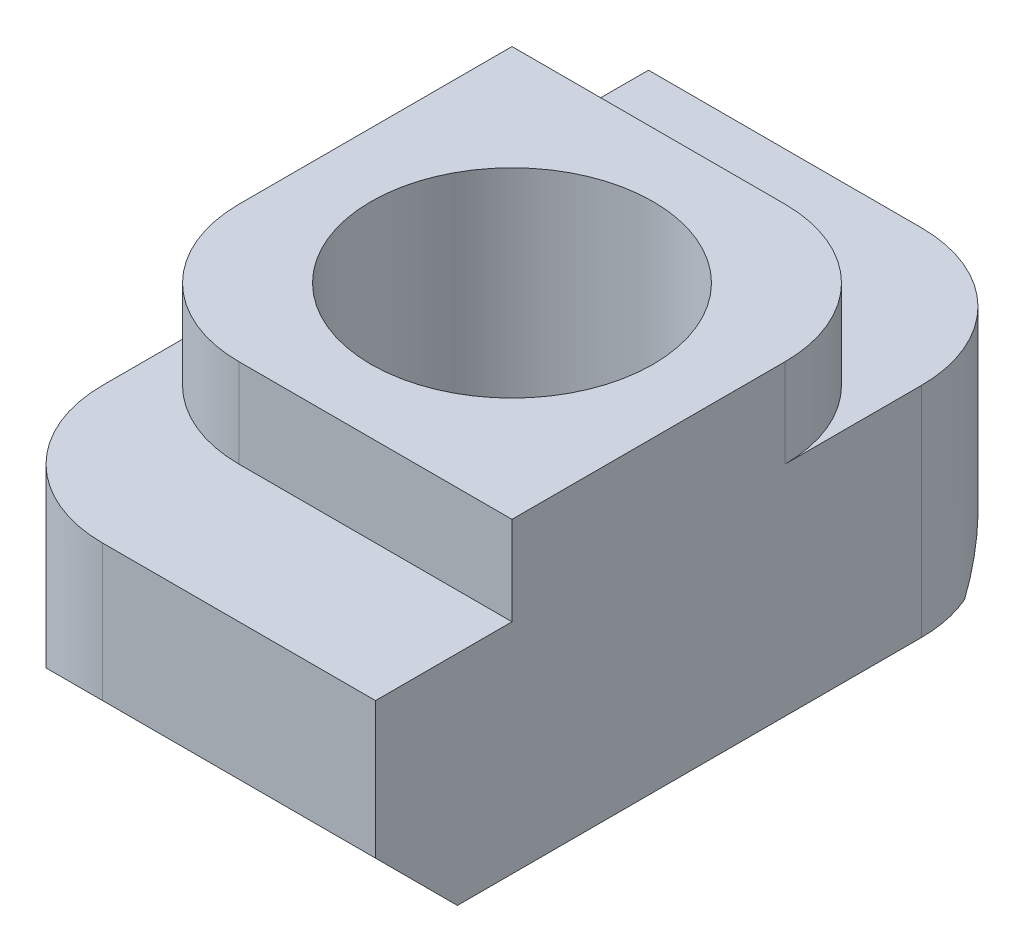
ISO-10303-21;
HEADER;
FILE_DESCRIPTION(('STEP AP214'),'2;1');
FILE_NAME('part.step','',(''),(''),'','','');
FILE_SCHEMA(('AUTOMOTIVE_DESIGN { 1 0 10303 214 1 1 1 1 }'));
ENDSEC;
DATA;
#1=APPLICATION_CONTEXT('core data for automotive mechanical design processes');
#2=APPLICATION_PROTOCOL_DEFINITION('international standard','automotive_design',2000,#1);
#3=PRODUCT_CONTEXT('',#1,'mechanical');
#4=PRODUCT('Part','Part','',(#3));
#5=PRODUCT_RELATED_PRODUCT_CATEGORY('part','',(#4));
#6=PRODUCT_DEFINITION_FORMATION('','',#4);
#7=PRODUCT_DEFINITION_CONTEXT('part definition',#1,'design');
#8=PRODUCT_DEFINITION('design','',#6,#7);
#9=PRODUCT_DEFINITION_SHAPE('','',#8);
#10=(LENGTH_UNIT() NAMED_UNIT(*) SI_UNIT(.MILLI.,.METRE.));
#11=(NAMED_UNIT(*) PLANE_ANGLE_UNIT() SI_UNIT($,.RADIAN.));
#12=(NAMED_UNIT(*) SI_UNIT($,.STERADIAN.) SOLID_ANGLE_UNIT());
#13=UNCERTAINTY_MEASURE_WITH_UNIT(LENGTH_MEASURE(1.E-05),#10,'distance_accuracy_value','');
#14=(GEOMETRIC_REPRESENTATION_CONTEXT(3) GLOBAL_UNCERTAINTY_ASSIGNED_CONTEXT((#13)) GLOBAL_UNIT_ASSIGNED_CONTEXT((#10,
#11,#12)) REPRESENTATION_CONTEXT('',''));
#15=CARTESIAN_POINT('',(0.,0.,0.));
#16=DIRECTION('',(0.,0.,1.));
#17=DIRECTION('',(1.,0.,0.));
#18=AXIS2_PLACEMENT_3D('',#15,#16,#17);
#19=CARTESIAN_POINT('',(3.,-1.3,3.));
#20=DIRECTION('',(0.,0.,-1.));
#21=DIRECTION('',(-1.,0.,0.));
#22=AXIS2_PLACEMENT_3D('',#19,#20,#21);
#23=PLANE('',#22);
#24=DIRECTION('',(-1.,0.,0.));
#25=VECTOR('',#24,1.);
#26=CARTESIAN_POINT('',(3.,0.,3.));
#27=LINE('',#26,#25);
#28=CARTESIAN_POINT('',(3.,0.,3.));
#29=VERTEX_POINT('',#28);
#30=CARTESIAN_POINT('',(-1.,0.,3.));
#31=VERTEX_POINT('',#30);
#32=EDGE_CURVE('E223',#29,#31,#27,.T.);
#33=ORIENTED_EDGE('',*,*,#32,.T.);
#34=DIRECTION('',(0.,-1.,0.));
#35=VECTOR('',#34,1.);
#36=CARTESIAN_POINT('',(-1.,-1.3,3.));
#37=LINE('',#36,#35);
#38=CARTESIAN_POINT('',(-1.,-1.3,3.));
#39=VERTEX_POINT('',#38);
#40=EDGE_CURVE('E161',#31,#39,#37,.T.);
#41=ORIENTED_EDGE('',*,*,#40,.T.);
#42=DIRECTION('',(-1.,0.,0.));
#43=VECTOR('',#42,1.);
#44=CARTESIAN_POINT('',(3.,-1.3,3.));
#45=LINE('',#44,#43);
#46=CARTESIAN_POINT('',(3.,-1.3,3.));
#47=VERTEX_POINT('',#46);
#48=EDGE_CURVE('E140',#47,#39,#45,.T.);
#49=ORIENTED_EDGE('',*,*,#48,.F.);
#50=DIRECTION('',(0.,-1.,0.));
#51=VECTOR('',#50,1.);
#52=CARTESIAN_POINT('',(3.,-1.3,3.));
#53=LINE('',#52,#51);
#54=EDGE_CURVE('E146',#29,#47,#53,.T.);
#55=ORIENTED_EDGE('',*,*,#54,.F.);
#56=EDGE_LOOP('',(#33,#41,#49,#55));
#57=FACE_BOUND('',#56,.T.);
#58=ADVANCED_FACE('F36',(#57),#23,.F.);
#59=CARTESIAN_POINT('',(3.,-1.3,5.));
#60=DIRECTION('',(0.,-1.,0.));
#61=DIRECTION('',(0.,0.,-1.));
#62=AXIS2_PLACEMENT_3D('',#59,#60,#61);
#63=PLANE('',#62);
#64=ORIENTED_EDGE('',*,*,#48,.T.);
#65=CARTESIAN_POINT('',(-1.,-1.3,1.));
#66=DIRECTION('',(0.,-1.,0.));
#67=DIRECTION('',(0.,0.,-1.));
#68=AXIS2_PLACEMENT_3D('',#65,#66,#67);
#69=CIRCLE('',#68,2.);
#70=CARTESIAN_POINT('',(-3.,-1.3,1.));
#71=VERTEX_POINT('',#70);
#72=EDGE_CURVE('E11',#39,#71,#69,.T.);
#73=ORIENTED_EDGE('',*,*,#72,.T.);
#74=DIRECTION('',(0.,0.,1.));
#75=VECTOR('',#74,1.);
#76=CARTESIAN_POINT('',(-3.,-1.3,5.));
#77=LINE('',#76,#75);
#78=CARTESIAN_POINT('',(-3.,-1.3,3.));
#79=VERTEX_POINT('',#78);
#80=EDGE_CURVE('E50',#79,#71,#77,.F.);
#81=ORIENTED_EDGE('',*,*,#80,.F.);
#82=CARTESIAN_POINT('',(-1.,-1.3,3.));
#83=DIRECTION('',(0.,-1.,0.));
#84=DIRECTION('',(0.,0.,-1.));
#85=AXIS2_PLACEMENT_3D('',#82,#83,#84);
#86=CIRCLE('',#85,2.);
#87=CARTESIAN_POINT('',(-1.,-1.3,5.));
#88=VERTEX_POINT('',#87);
#89=EDGE_CURVE('E200',#79,#88,#86,.F.);
#90=ORIENTED_EDGE('',*,*,#89,.T.);
#91=DIRECTION('',(-1.,0.,0.));
#92=VECTOR('',#91,1.);
#93=CARTESIAN_POINT('',(3.,-1.3,5.));
#94=LINE('',#93,#92);
#95=CARTESIAN_POINT('',(3.,-1.3,5.));
#96=VERTEX_POINT('',#95);
#97=EDGE_CURVE('E142',#96,#88,#94,.T.);
#98=ORIENTED_EDGE('',*,*,#97,.F.);
#99=DIRECTION('',(0.,0.,1.));
#100=VECTOR('',#99,1.);
#101=CARTESIAN_POINT('',(3.,-1.3,5.));
#102=LINE('',#101,#100);
#103=EDGE_CURVE('E136',#47,#96,#102,.T.);
#104=ORIENTED_EDGE('',*,*,#103,.F.);
#105=EDGE_LOOP('',(#64,#73,#81,#90,#98,#104));
#106=FACE_BOUND('',#105,.T.);
#107=ADVANCED_FACE('F138',(#106),#63,.F.);
#108=CARTESIAN_POINT('',(3.,-3.3,5.));
#109=DIRECTION('',(0.,0.,-1.));
#110=DIRECTION('',(-1.,0.,0.));
#111=AXIS2_PLACEMENT_3D('',#108,#109,#110);
#112=PLANE('',#111);
#113=ORIENTED_EDGE('',*,*,#97,.T.);
#114=DIRECTION('',(0.,-1.,0.));
#115=VECTOR('',#114,1.);
#116=CARTESIAN_POINT('',(-1.,-3.3,5.));
#117=LINE('',#116,#115);
#118=CARTESIAN_POINT('',(-1.,-3.3,5.));
#119=VERTEX_POINT('',#118);
#120=EDGE_CURVE('E195',#88,#119,#117,.T.);
#121=ORIENTED_EDGE('',*,*,#120,.T.);
#122=DIRECTION('',(-1.,0.,0.));
#123=VECTOR('',#122,1.);
#124=CARTESIAN_POINT('',(3.,-3.3,5.));
#125=LINE('',#124,#123);
#126=CARTESIAN_POINT('',(3.,-3.3,5.));
#127=VERTEX_POINT('',#126);
#128=EDGE_CURVE('E167',#127,#119,#125,.T.);
#129=ORIENTED_EDGE('',*,*,#128,.F.);
#130=DIRECTION('',(0.,-1.,0.));
#131=VECTOR('',#130,1.);
#132=CARTESIAN_POINT('',(3.,-3.3,5.));
#133=LINE('',#132,#131);
#134=EDGE_CURVE('E145',#96,#127,#133,.T.);
#135=ORIENTED_EDGE('',*,*,#134,.F.);
#136=EDGE_LOOP('',(#113,#121,#129,#135));
#137=FACE_BOUND('',#136,.T.);
#138=ADVANCED_FACE('F245',(#137),#112,.F.);
#139=CARTESIAN_POINT('',(3.,-4.5,3.8));
#140=DIRECTION('',(0.,0.707106781186546,-0.707106781186548));
#141=DIRECTION('',(0.,0.707106781186549,0.707106781186547));
#142=AXIS2_PLACEMENT_3D('',#139,#140,#141);
#143=PLANE('',#142);
#144=ORIENTED_EDGE('',*,*,#128,.T.);
#145=CARTESIAN_POINT('',(-1.,-5.30000000000001,3.));
#146=DIRECTION('',(0.,0.707106781186546,-0.707106781186548));
#147=DIRECTION('',(0.,0.707106781186549,0.707106781186547));
#148=AXIS2_PLACEMENT_3D('',#145,#146,#147);
#149=ELLIPSE('',#148,2.82842712474619,2.);
#150=CARTESIAN_POINT('',(-2.83303027798233,-4.5,3.8));
#151=VERTEX_POINT('',#150);
#152=EDGE_CURVE('E198',#119,#151,#149,.F.);
#153=ORIENTED_EDGE('',*,*,#152,.T.);
#154=DIRECTION('',(-1.,0.,0.));
#155=VECTOR('',#154,1.);
#156=CARTESIAN_POINT('',(3.,-4.5,3.8));
#157=LINE('',#156,#155);
#158=CARTESIAN_POINT('',(3.,-4.5,3.8));
#159=VERTEX_POINT('',#158);
#160=EDGE_CURVE('E235',#159,#151,#157,.T.);
#161=ORIENTED_EDGE('',*,*,#160,.F.);
#162=DIRECTION('',(0.,-0.707106781186549,-0.707106781186547));
#163=VECTOR('',#162,1.);
#164=CARTESIAN_POINT('',(3.,-4.5,3.8));
#165=LINE('',#164,#163);
#166=EDGE_CURVE('E243',#127,#159,#165,.T.);
#167=ORIENTED_EDGE('',*,*,#166,.F.);
#168=EDGE_LOOP('',(#144,#153,#161,#167));
#169=FACE_BOUND('',#168,.T.);
#170=ADVANCED_FACE('F241',(#169),#143,.F.);
#171=CARTESIAN_POINT('',(3.,-4.5,-3.8));
#172=DIRECTION('',(0.,1.,0.));
#173=DIRECTION('',(0.,0.,1.));
#174=AXIS2_PLACEMENT_3D('',#171,#172,#173);
#175=PLANE('',#174);
#176=CARTESIAN_POINT('',(0.,-4.5,0.));
#177=DIRECTION('',(0.,1.,0.));
#178=DIRECTION('',(0.,0.,1.));
#179=AXIS2_PLACEMENT_3D('',#176,#177,#178);
#180=CIRCLE('',#179,2.067);
#181=CARTESIAN_POINT('',(0.,-4.5,2.067));
#182=VERTEX_POINT('',#181);
#183=EDGE_CURVE('E264',#182,#182,#180,.T.);
#184=ORIENTED_EDGE('',*,*,#183,.T.);
#185=EDGE_LOOP('',(#184));
#186=FACE_BOUND('',#185,.T.);
#187=DIRECTION('',(-1.,0.,0.));
#188=VECTOR('',#187,1.);
#189=CARTESIAN_POINT('',(3.,-4.5,-3.8));
#190=LINE('',#189,#188);
#191=CARTESIAN_POINT('',(2.83303027798234,-4.5,-3.8));
#192=VERTEX_POINT('',#191);
#193=CARTESIAN_POINT('',(-3.,-4.5,-3.8));
#194=VERTEX_POINT('',#193);
#195=EDGE_CURVE('E233',#192,#194,#190,.T.);
#196=ORIENTED_EDGE('',*,*,#195,.F.);
#197=CARTESIAN_POINT('',(1.,-4.5,-3.));
#198=DIRECTION('',(0.,1.,0.));
#199=DIRECTION('',(0.,0.,1.));
#200=AXIS2_PLACEMENT_3D('',#197,#198,#199);
#201=CIRCLE('',#200,2.);
#202=CARTESIAN_POINT('',(3.,-4.5,-3.));
#203=VERTEX_POINT('',#202);
#204=EDGE_CURVE('E193',#192,#203,#201,.F.);
#205=ORIENTED_EDGE('',*,*,#204,.T.);
#206=DIRECTION('',(0.,0.,-1.));
#207=VECTOR('',#206,1.);
#208=CARTESIAN_POINT('',(3.,-4.5,-3.8));
#209=LINE('',#208,#207);
#210=EDGE_CURVE('E336',#159,#203,#209,.T.);
#211=ORIENTED_EDGE('',*,*,#210,.F.);
#212=ORIENTED_EDGE('',*,*,#160,.T.);
#213=CARTESIAN_POINT('',(-1.,-4.5,3.));
#214=DIRECTION('',(0.,1.,0.));
#215=DIRECTION('',(0.,0.,1.));
#216=AXIS2_PLACEMENT_3D('',#213,#214,#215);
#217=CIRCLE('',#216,2.);
#218=CARTESIAN_POINT('',(-3.,-4.5,3.));
#219=VERTEX_POINT('',#218);
#220=EDGE_CURVE('E191',#151,#219,#217,.F.);
#221=ORIENTED_EDGE('',*,*,#220,.T.);
#222=DIRECTION('',(0.,0.,-1.));
#223=VECTOR('',#222,1.);
#224=CARTESIAN_POINT('',(-3.,-4.5,-3.8));
#225=LINE('',#224,#223);
#226=EDGE_CURVE('E256',#219,#194,#225,.T.);
#227=ORIENTED_EDGE('',*,*,#226,.T.);
#228=EDGE_LOOP('',(#196,#205,#211,#212,#221,#227));
#229=FACE_BOUND('',#228,.T.);
#230=ADVANCED_FACE('F255',(#186,#229),#175,.F.);
#231=CARTESIAN_POINT('',(3.,-3.3,-5.));
#232=DIRECTION('',(0.,0.707106781186549,0.707106781186547));
#233=DIRECTION('',(0.,-0.707106781186547,0.707106781186549));
#234=AXIS2_PLACEMENT_3D('',#231,#232,#233);
#235=PLANE('',#234);
#236=DIRECTION('',(-1.,0.,0.));
#237=VECTOR('',#236,1.);
#238=CARTESIAN_POINT('',(3.,-3.3,-5.));
#239=LINE('',#238,#237);
#240=CARTESIAN_POINT('',(1.,-3.3,-5.));
#241=VERTEX_POINT('',#240);
#242=CARTESIAN_POINT('',(-3.,-3.3,-5.));
#243=VERTEX_POINT('',#242);
#244=EDGE_CURVE('E231',#241,#243,#239,.T.);
#245=ORIENTED_EDGE('',*,*,#244,.F.);
#246=CARTESIAN_POINT('',(1.,-5.29999999999999,-3.));
#247=DIRECTION('',(0.,0.707106781186549,0.707106781186547));
#248=DIRECTION('',(0.,0.707106781186547,-0.707106781186549));
#249=AXIS2_PLACEMENT_3D('',#246,#247,#248);
#250=ELLIPSE('',#249,2.82842712474619,2.);
#251=EDGE_CURVE('E189',#241,#192,#250,.F.);
#252=ORIENTED_EDGE('',*,*,#251,.T.);
#253=ORIENTED_EDGE('',*,*,#195,.T.);
#254=DIRECTION('',(0.,0.707106781186546,-0.707106781186548));
#255=VECTOR('',#254,1.);
#256=CARTESIAN_POINT('',(-3.,-3.3,-5.));
#257=LINE('',#256,#255);
#258=EDGE_CURVE('E263',#194,#243,#257,.T.);
#259=ORIENTED_EDGE('',*,*,#258,.T.);
#260=EDGE_LOOP('',(#245,#252,#253,#259));
#261=FACE_BOUND('',#260,.T.);
#262=ADVANCED_FACE('F303',(#261),#235,.F.);
#263=CARTESIAN_POINT('',(3.,-1.3,-5.));
#264=DIRECTION('',(0.,0.,1.));
#265=DIRECTION('',(1.,0.,0.));
#266=AXIS2_PLACEMENT_3D('',#263,#264,#265);
#267=PLANE('',#266);
#268=DIRECTION('',(-1.,0.,0.));
#269=VECTOR('',#268,1.);
#270=CARTESIAN_POINT('',(3.,-1.3,-5.));
#271=LINE('',#270,#269);
#272=CARTESIAN_POINT('',(1.,-1.3,-5.));
#273=VERTEX_POINT('',#272);
#274=CARTESIAN_POINT('',(-3.,-1.3,-5.));
#275=VERTEX_POINT('',#274);
#276=EDGE_CURVE('E225',#273,#275,#271,.T.);
#277=ORIENTED_EDGE('',*,*,#276,.F.);
#278=DIRECTION('',(0.,1.,0.));
#279=VECTOR('',#278,1.);
#280=CARTESIAN_POINT('',(1.,-1.3,-5.));
#281=LINE('',#280,#279);
#282=EDGE_CURVE('E187',#273,#241,#281,.F.);
#283=ORIENTED_EDGE('',*,*,#282,.T.);
#284=ORIENTED_EDGE('',*,*,#244,.T.);
#285=DIRECTION('',(0.,1.,0.));
#286=VECTOR('',#285,1.);
#287=CARTESIAN_POINT('',(-3.,-1.3,-5.));
#288=LINE('',#287,#286);
#289=EDGE_CURVE('E266',#243,#275,#288,.T.);
#290=ORIENTED_EDGE('',*,*,#289,.T.);
#291=EDGE_LOOP('',(#277,#283,#284,#290));
#292=FACE_BOUND('',#291,.T.);
#293=ADVANCED_FACE('F307',(#292),#267,.F.);
#294=CARTESIAN_POINT('',(3.,-1.3,-3.));
#295=DIRECTION('',(0.,-1.,0.));
#296=DIRECTION('',(0.,0.,-1.));
#297=AXIS2_PLACEMENT_3D('',#294,#295,#296);
#298=PLANE('',#297);
#299=DIRECTION('',(-1.,0.,0.));
#300=VECTOR('',#299,1.);
#301=CARTESIAN_POINT('',(3.,-1.3,-3.));
#302=LINE('',#301,#300);
#303=CARTESIAN_POINT('',(1.,-1.3,-3.));
#304=VERTEX_POINT('',#303);
#305=CARTESIAN_POINT('',(-3.,-1.3,-3.));
#306=VERTEX_POINT('',#305);
#307=EDGE_CURVE('E206',#304,#306,#302,.T.);
#308=ORIENTED_EDGE('',*,*,#307,.F.);
#309=CARTESIAN_POINT('',(1.,-1.3,-1.));
#310=DIRECTION('',(0.,-1.,0.));
#311=DIRECTION('',(0.,0.,-1.));
#312=AXIS2_PLACEMENT_3D('',#309,#310,#311);
#313=CIRCLE('',#312,2.);
#314=CARTESIAN_POINT('',(3.,-1.3,-1.));
#315=VERTEX_POINT('',#314);
#316=EDGE_CURVE('E44',#304,#315,#313,.T.);
#317=ORIENTED_EDGE('',*,*,#316,.T.);
#318=DIRECTION('',(0.,0.,1.));
#319=VECTOR('',#318,1.);
#320=CARTESIAN_POINT('',(3.,-1.3,-3.));
#321=LINE('',#320,#319);
#322=CARTESIAN_POINT('',(3.,-1.3,-3.));
#323=VERTEX_POINT('',#322);
#324=EDGE_CURVE('E165',#323,#315,#321,.T.);
#325=ORIENTED_EDGE('',*,*,#324,.F.);
#326=CARTESIAN_POINT('',(1.,-1.3,-3.));
#327=DIRECTION('',(0.,-1.,0.));
#328=DIRECTION('',(0.,0.,-1.));
#329=AXIS2_PLACEMENT_3D('',#326,#327,#328);
#330=CIRCLE('',#329,2.);
#331=EDGE_CURVE('E58',#323,#273,#330,.F.);
#332=ORIENTED_EDGE('',*,*,#331,.T.);
#333=ORIENTED_EDGE('',*,*,#276,.T.);
#334=DIRECTION('',(0.,0.,1.));
#335=VECTOR('',#334,1.);
#336=CARTESIAN_POINT('',(-3.,-1.3,-3.));
#337=LINE('',#336,#335);
#338=EDGE_CURVE('E276',#275,#306,#337,.T.);
#339=ORIENTED_EDGE('',*,*,#338,.T.);
#340=EDGE_LOOP('',(#308,#317,#325,#332,#333,#339));
#341=FACE_BOUND('',#340,.T.);
#342=ADVANCED_FACE('F204',(#341),#298,.F.);
#343=CARTESIAN_POINT('',(3.,0.,-3.));
#344=DIRECTION('',(0.,0.,1.));
#345=DIRECTION('',(1.,0.,0.));
#346=AXIS2_PLACEMENT_3D('',#343,#344,#345);
#347=PLANE('',#346);
#348=DIRECTION('',(-1.,0.,0.));
#349=VECTOR('',#348,1.);
#350=CARTESIAN_POINT('',(3.,0.,-3.));
#351=LINE('',#350,#349);
#352=CARTESIAN_POINT('',(1.,0.,-3.));
#353=VERTEX_POINT('',#352);
#354=CARTESIAN_POINT('',(-3.,0.,-3.));
#355=VERTEX_POINT('',#354);
#356=EDGE_CURVE('E216',#353,#355,#351,.T.);
#357=ORIENTED_EDGE('',*,*,#356,.F.);
#358=DIRECTION('',(0.,1.,0.));
#359=VECTOR('',#358,1.);
#360=CARTESIAN_POINT('',(1.,0.,-3.));
#361=LINE('',#360,#359);
#362=EDGE_CURVE('E178',#353,#304,#361,.F.);
#363=ORIENTED_EDGE('',*,*,#362,.T.);
#364=ORIENTED_EDGE('',*,*,#307,.T.);
#365=DIRECTION('',(0.,1.,0.));
#366=VECTOR('',#365,1.);
#367=CARTESIAN_POINT('',(-3.,0.,-3.));
#368=LINE('',#367,#366);
#369=EDGE_CURVE('E221',#306,#355,#368,.T.);
#370=ORIENTED_EDGE('',*,*,#369,.T.);
#371=EDGE_LOOP('',(#357,#363,#364,#370));
#372=FACE_BOUND('',#371,.T.);
#373=ADVANCED_FACE('F219',(#372),#347,.F.);
#374=CARTESIAN_POINT('',(3.,0.,3.));
#375=DIRECTION('',(0.,-1.,0.));
#376=DIRECTION('',(0.,0.,-1.));
#377=AXIS2_PLACEMENT_3D('',#374,#375,#376);
#378=PLANE('',#377);
#379=CARTESIAN_POINT('',(0.,0.,0.));
#380=DIRECTION('',(0.,1.,0.));
#381=DIRECTION('',(0.,0.,1.));
#382=AXIS2_PLACEMENT_3D('',#379,#380,#381);
#383=CIRCLE('',#382,2.067);
#384=CARTESIAN_POINT('',(0.,0.,2.067));
#385=VERTEX_POINT('',#384);
#386=EDGE_CURVE('E269',#385,#385,#383,.T.);
#387=ORIENTED_EDGE('',*,*,#386,.F.);
#388=EDGE_LOOP('',(#387));
#389=FACE_BOUND('',#388,.T.);
#390=DIRECTION('',(0.,0.,1.));
#391=VECTOR('',#390,1.);
#392=CARTESIAN_POINT('',(3.,0.,3.));
#393=LINE('',#392,#391);
#394=CARTESIAN_POINT('',(3.,0.,-1.));
#395=VERTEX_POINT('',#394);
#396=EDGE_CURVE('E153',#395,#29,#393,.T.);
#397=ORIENTED_EDGE('',*,*,#396,.F.);
#398=CARTESIAN_POINT('',(1.,0.,-1.));
#399=DIRECTION('',(0.,-1.,0.));
#400=DIRECTION('',(0.,0.,-1.));
#401=AXIS2_PLACEMENT_3D('',#398,#399,#400);
#402=CIRCLE('',#401,2.);
#403=EDGE_CURVE('E176',#395,#353,#402,.F.);
#404=ORIENTED_EDGE('',*,*,#403,.T.);
#405=ORIENTED_EDGE('',*,*,#356,.T.);
#406=DIRECTION('',(0.,0.,1.));
#407=VECTOR('',#406,1.);
#408=CARTESIAN_POINT('',(-3.,0.,3.));
#409=LINE('',#408,#407);
#410=CARTESIAN_POINT('',(-3.,0.,1.));
#411=VERTEX_POINT('',#410);
#412=EDGE_CURVE('E157',#355,#411,#409,.T.);
#413=ORIENTED_EDGE('',*,*,#412,.T.);
#414=CARTESIAN_POINT('',(-1.,0.,1.));
#415=DIRECTION('',(0.,-1.,0.));
#416=DIRECTION('',(0.,0.,-1.));
#417=AXIS2_PLACEMENT_3D('',#414,#415,#416);
#418=CIRCLE('',#417,2.);
#419=EDGE_CURVE('E174',#411,#31,#418,.F.);
#420=ORIENTED_EDGE('',*,*,#419,.T.);
#421=ORIENTED_EDGE('',*,*,#32,.F.);
#422=EDGE_LOOP('',(#397,#404,#405,#413,#420,#421));
#423=FACE_BOUND('',#422,.T.);
#424=ADVANCED_FACE('F214',(#389,#423),#378,.F.);
#425=CARTESIAN_POINT('',(3.,0.,0.));
#426=DIRECTION('',(-1.,0.,0.));
#427=DIRECTION('',(0.,0.,1.));
#428=AXIS2_PLACEMENT_3D('',#425,#426,#427);
#429=PLANE('',#428);
#430=ORIENTED_EDGE('',*,*,#324,.T.);
#431=DIRECTION('',(0.,1.,0.));
#432=VECTOR('',#431,1.);
#433=CARTESIAN_POINT('',(3.,0.,-1.));
#434=LINE('',#433,#432);
#435=EDGE_CURVE('E172',#315,#395,#434,.T.);
#436=ORIENTED_EDGE('',*,*,#435,.T.);
#437=ORIENTED_EDGE('',*,*,#396,.T.);
#438=ORIENTED_EDGE('',*,*,#54,.T.);
#439=ORIENTED_EDGE('',*,*,#103,.T.);
#440=ORIENTED_EDGE('',*,*,#134,.T.);
#441=ORIENTED_EDGE('',*,*,#166,.T.);
#442=ORIENTED_EDGE('',*,*,#210,.T.);
#443=DIRECTION('',(0.,1.,0.));
#444=VECTOR('',#443,1.);
#445=CARTESIAN_POINT('',(3.,0.,-3.));
#446=LINE('',#445,#444);
#447=EDGE_CURVE('E162',#203,#323,#446,.T.);
#448=ORIENTED_EDGE('',*,*,#447,.T.);
#449=EDGE_LOOP('',(#430,#436,#437,#438,#439,#440,#441,#442,#448));
#450=FACE_BOUND('',#449,.T.);
#451=ADVANCED_FACE('F150',(#450),#429,.F.);
#452=CARTESIAN_POINT('',(-3.,0.,0.));
#453=DIRECTION('',(-1.,0.,0.));
#454=DIRECTION('',(0.,0.,1.));
#455=AXIS2_PLACEMENT_3D('',#452,#453,#454);
#456=PLANE('',#455);
#457=ORIENTED_EDGE('',*,*,#80,.T.);
#458=DIRECTION('',(0.,-1.,0.));
#459=VECTOR('',#458,1.);
#460=CARTESIAN_POINT('',(-3.,0.,1.));
#461=LINE('',#460,#459);
#462=EDGE_CURVE('E184',#71,#411,#461,.F.);
#463=ORIENTED_EDGE('',*,*,#462,.T.);
#464=ORIENTED_EDGE('',*,*,#412,.F.);
#465=ORIENTED_EDGE('',*,*,#369,.F.);
#466=ORIENTED_EDGE('',*,*,#338,.F.);
#467=ORIENTED_EDGE('',*,*,#289,.F.);
#468=ORIENTED_EDGE('',*,*,#258,.F.);
#469=ORIENTED_EDGE('',*,*,#226,.F.);
#470=DIRECTION('',(0.,-1.,0.));
#471=VECTOR('',#470,1.);
#472=CARTESIAN_POINT('',(-3.,-1.3,3.));
#473=LINE('',#472,#471);
#474=EDGE_CURVE('E181',#219,#79,#473,.F.);
#475=ORIENTED_EDGE('',*,*,#474,.T.);
#476=EDGE_LOOP('',(#457,#463,#464,#465,#466,#467,#468,#469,#475));
#477=FACE_BOUND('',#476,.T.);
#478=ADVANCED_FACE('F260',(#477),#456,.T.);
#479=CARTESIAN_POINT('',(1.,0.,-1.));
#480=DIRECTION('',(0.,1.,0.));
#481=DIRECTION('',(0.,0.,1.));
#482=AXIS2_PLACEMENT_3D('',#479,#480,#481);
#483=CYLINDRICAL_SURFACE('',#482,2.);
#484=ORIENTED_EDGE('',*,*,#316,.F.);
#485=ORIENTED_EDGE('',*,*,#362,.F.);
#486=ORIENTED_EDGE('',*,*,#403,.F.);
#487=ORIENTED_EDGE('',*,*,#435,.F.);
#488=EDGE_LOOP('',(#484,#485,#486,#487));
#489=FACE_BOUND('',#488,.T.);
#490=ADVANCED_FACE('F211',(#489),#483,.T.);
#491=CARTESIAN_POINT('',(-1.,-1.3,1.));
#492=DIRECTION('',(0.,1.,0.));
#493=DIRECTION('',(0.,0.,1.));
#494=AXIS2_PLACEMENT_3D('',#491,#492,#493);
#495=CYLINDRICAL_SURFACE('',#494,2.);
#496=ORIENTED_EDGE('',*,*,#419,.F.);
#497=ORIENTED_EDGE('',*,*,#462,.F.);
#498=ORIENTED_EDGE('',*,*,#72,.F.);
#499=ORIENTED_EDGE('',*,*,#40,.F.);
#500=EDGE_LOOP('',(#496,#497,#498,#499));
#501=FACE_BOUND('',#500,.T.);
#502=ADVANCED_FACE('F281',(#501),#495,.T.);
#503=CARTESIAN_POINT('',(1.,0.,-3.));
#504=DIRECTION('',(0.,1.,0.));
#505=DIRECTION('',(0.,0.,1.));
#506=AXIS2_PLACEMENT_3D('',#503,#504,#505);
#507=CYLINDRICAL_SURFACE('',#506,2.);
#508=ORIENTED_EDGE('',*,*,#251,.F.);
#509=ORIENTED_EDGE('',*,*,#282,.F.);
#510=ORIENTED_EDGE('',*,*,#331,.F.);
#511=ORIENTED_EDGE('',*,*,#447,.F.);
#512=ORIENTED_EDGE('',*,*,#204,.F.);
#513=EDGE_LOOP('',(#508,#509,#510,#511,#512));
#514=FACE_BOUND('',#513,.T.);
#515=ADVANCED_FACE('F283',(#514),#507,.T.);
#516=CARTESIAN_POINT('',(-1.,-3.3,3.));
#517=DIRECTION('',(0.,1.,0.));
#518=DIRECTION('',(0.,0.,1.));
#519=AXIS2_PLACEMENT_3D('',#516,#517,#518);
#520=CYLINDRICAL_SURFACE('',#519,2.);
#521=ORIENTED_EDGE('',*,*,#89,.F.);
#522=ORIENTED_EDGE('',*,*,#474,.F.);
#523=ORIENTED_EDGE('',*,*,#220,.F.);
#524=ORIENTED_EDGE('',*,*,#152,.F.);
#525=ORIENTED_EDGE('',*,*,#120,.F.);
#526=EDGE_LOOP('',(#521,#522,#523,#524,#525));
#527=FACE_BOUND('',#526,.T.);
#528=ADVANCED_FACE('F38',(#527),#520,.T.);
#529=CARTESIAN_POINT('',(0.,0.,0.));
#530=DIRECTION('',(0.,1.,0.));
#531=DIRECTION('',(0.,0.,1.));
#532=AXIS2_PLACEMENT_3D('',#529,#530,#531);
#533=CYLINDRICAL_SURFACE('',#532,2.067);
#534=ORIENTED_EDGE('',*,*,#183,.F.);
#535=EDGE_LOOP('',(#534));
#536=FACE_BOUND('',#535,.T.);
#537=ORIENTED_EDGE('',*,*,#386,.T.);
#538=EDGE_LOOP('',(#537));
#539=FACE_BOUND('',#538,.T.);
#540=ADVANCED_FACE('F323',(#536,#539),#533,.F.);
#541=CLOSED_SHELL('',(#58,#107,#138,#170,#230,#262,#293,#342,#373,#424,#451,#478,#490,#502,#515,
#528,#540));
#542=MANIFOLD_SOLID_BREP('B2',#541);
#543=ADVANCED_BREP_SHAPE_REPRESENTATION('',(#18,#542),#14);
#544=SHAPE_DEFINITION_REPRESENTATION(#9,#543);
ENDSEC;
END-ISO-10303-21;
